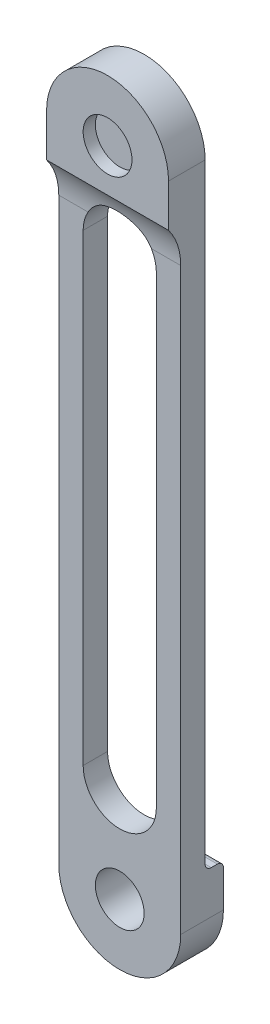
ISO-10303-21;
HEADER;
FILE_DESCRIPTION(('STEP AP214'),'2;1');
FILE_NAME('part.step','',(''),(''),'','','');
FILE_SCHEMA(('AUTOMOTIVE_DESIGN { 1 0 10303 214 1 1 1 1 }'));
ENDSEC;
DATA;
#1=APPLICATION_CONTEXT('core data for automotive mechanical design processes');
#2=APPLICATION_PROTOCOL_DEFINITION('international standard','automotive_design',2000,#1);
#3=PRODUCT_CONTEXT('',#1,'mechanical');
#4=PRODUCT('Part','Part','',(#3));
#5=PRODUCT_RELATED_PRODUCT_CATEGORY('part','',(#4));
#6=PRODUCT_DEFINITION_FORMATION('','',#4);
#7=PRODUCT_DEFINITION_CONTEXT('part definition',#1,'design');
#8=PRODUCT_DEFINITION('design','',#6,#7);
#9=PRODUCT_DEFINITION_SHAPE('','',#8);
#10=(LENGTH_UNIT() NAMED_UNIT(*) SI_UNIT(.MILLI.,.METRE.));
#11=(NAMED_UNIT(*) PLANE_ANGLE_UNIT() SI_UNIT($,.RADIAN.));
#12=(NAMED_UNIT(*) SI_UNIT($,.STERADIAN.) SOLID_ANGLE_UNIT());
#13=UNCERTAINTY_MEASURE_WITH_UNIT(LENGTH_MEASURE(1.E-05),#10,'distance_accuracy_value','');
#14=(GEOMETRIC_REPRESENTATION_CONTEXT(3) GLOBAL_UNCERTAINTY_ASSIGNED_CONTEXT((#13)) GLOBAL_UNIT_ASSIGNED_CONTEXT((#10,
#11,#12)) REPRESENTATION_CONTEXT('',''));
#15=CARTESIAN_POINT('',(0.,0.,0.));
#16=DIRECTION('',(0.,0.,1.));
#17=DIRECTION('',(1.,0.,0.));
#18=AXIS2_PLACEMENT_3D('',#15,#16,#17);
#19=CARTESIAN_POINT('',(0.,0.,4.));
#20=DIRECTION('',(0.,0.,1.));
#21=DIRECTION('',(1.,0.,0.));
#22=AXIS2_PLACEMENT_3D('',#19,#20,#21);
#23=PLANE('',#22);
#24=DIRECTION('',(0.,-1.,0.));
#25=VECTOR('',#24,1.);
#26=CARTESIAN_POINT('',(10.,0.,4.));
#27=LINE('',#26,#25);
#28=CARTESIAN_POINT('',(10.,41.,4.));
#29=VERTEX_POINT('',#28);
#30=CARTESIAN_POINT('',(9.99999999999999,-54.,4.));
#31=VERTEX_POINT('',#30);
#32=EDGE_CURVE('E305',#29,#31,#27,.T.);
#33=ORIENTED_EDGE('',*,*,#32,.F.);
#34=DIRECTION('',(-1.,0.,0.));
#35=VECTOR('',#34,1.);
#36=CARTESIAN_POINT('',(-9.99999999999999,41.,4.));
#37=LINE('',#36,#35);
#38=CARTESIAN_POINT('',(5.19615242270664,41.,4.));
#39=VERTEX_POINT('',#38);
#40=EDGE_CURVE('E408',#29,#39,#37,.T.);
#41=ORIENTED_EDGE('',*,*,#40,.T.);
#42=CARTESIAN_POINT('',(0.,38.,4.));
#43=DIRECTION('',(0.,0.,1.));
#44=DIRECTION('',(1.,0.,0.));
#45=AXIS2_PLACEMENT_3D('',#42,#43,#44);
#46=CIRCLE('',#45,6.00000000000001);
#47=CARTESIAN_POINT('',(5.99999999999999,38.,4.));
#48=VERTEX_POINT('',#47);
#49=EDGE_CURVE('E319',#48,#39,#46,.T.);
#50=ORIENTED_EDGE('',*,*,#49,.F.);
#51=DIRECTION('',(0.,-1.,0.));
#52=VECTOR('',#51,1.);
#53=CARTESIAN_POINT('',(5.99999999999999,0.,4.));
#54=LINE('',#53,#52);
#55=CARTESIAN_POINT('',(5.99999999999999,-38.,4.));
#56=VERTEX_POINT('',#55);
#57=EDGE_CURVE('E321',#48,#56,#54,.T.);
#58=ORIENTED_EDGE('',*,*,#57,.T.);
#59=CARTESIAN_POINT('',(0.,-38.,4.));
#60=DIRECTION('',(0.,0.,1.));
#61=DIRECTION('',(1.,0.,0.));
#62=AXIS2_PLACEMENT_3D('',#59,#60,#61);
#63=CIRCLE('',#62,6.00000000000001);
#64=CARTESIAN_POINT('',(-6.00000000000002,-38.,4.));
#65=VERTEX_POINT('',#64);
#66=EDGE_CURVE('E307',#65,#56,#63,.T.);
#67=ORIENTED_EDGE('',*,*,#66,.F.);
#68=DIRECTION('',(0.,-1.,0.));
#69=VECTOR('',#68,1.);
#70=CARTESIAN_POINT('',(-6.00000000000002,0.,4.));
#71=LINE('',#70,#69);
#72=CARTESIAN_POINT('',(-6.00000000000002,38.,4.));
#73=VERTEX_POINT('',#72);
#74=EDGE_CURVE('E312',#73,#65,#71,.T.);
#75=ORIENTED_EDGE('',*,*,#74,.F.);
#76=CARTESIAN_POINT('',(-5.19615242270664,41.,4.));
#77=VERTEX_POINT('',#76);
#78=EDGE_CURVE('E320',#77,#73,#46,.T.);
#79=ORIENTED_EDGE('',*,*,#78,.F.);
#80=DIRECTION('',(-1.,0.,0.));
#81=VECTOR('',#80,1.);
#82=CARTESIAN_POINT('',(-9.99999999999999,41.,4.));
#83=LINE('',#82,#81);
#84=CARTESIAN_POINT('',(-9.99999999999999,41.,4.));
#85=VERTEX_POINT('',#84);
#86=EDGE_CURVE('E152',#77,#85,#83,.T.);
#87=ORIENTED_EDGE('',*,*,#86,.T.);
#88=DIRECTION('',(0.,-1.,0.));
#89=VECTOR('',#88,1.);
#90=CARTESIAN_POINT('',(-9.99999999999999,0.,4.));
#91=LINE('',#90,#89);
#92=CARTESIAN_POINT('',(-9.99999999999999,-54.,4.));
#93=VERTEX_POINT('',#92);
#94=EDGE_CURVE('E304',#85,#93,#91,.T.);
#95=ORIENTED_EDGE('',*,*,#94,.T.);
#96=CARTESIAN_POINT('',(0.,-54.,4.));
#97=DIRECTION('',(0.,0.,1.));
#98=DIRECTION('',(1.,0.,0.));
#99=AXIS2_PLACEMENT_3D('',#96,#97,#98);
#100=CIRCLE('',#99,10.);
#101=EDGE_CURVE('E366',#93,#31,#100,.T.);
#102=ORIENTED_EDGE('',*,*,#101,.T.);
#103=EDGE_LOOP('',(#33,#41,#50,#58,#67,#75,#79,#87,#95,#102));
#104=FACE_BOUND('',#103,.T.);
#105=CARTESIAN_POINT('',(0.,-54.,4.));
#106=DIRECTION('',(0.,0.,1.));
#107=DIRECTION('',(1.,0.,0.));
#108=AXIS2_PLACEMENT_3D('',#105,#106,#107);
#109=CIRCLE('',#108,4.);
#110=CARTESIAN_POINT('',(3.99999999999999,-54.,4.));
#111=VERTEX_POINT('',#110);
#112=EDGE_CURVE('E296',#111,#111,#109,.T.);
#113=ORIENTED_EDGE('',*,*,#112,.F.);
#114=EDGE_LOOP('',(#113));
#115=FACE_BOUND('',#114,.T.);
#116=ADVANCED_FACE('F131',(#104,#115),#23,.T.);
#117=CARTESIAN_POINT('',(0.,0.,0.));
#118=DIRECTION('',(0.,0.,1.));
#119=DIRECTION('',(1.,0.,0.));
#120=AXIS2_PLACEMENT_3D('',#117,#118,#119);
#121=PLANE('',#120);
#122=DIRECTION('',(0.,-1.,0.));
#123=VECTOR('',#122,1.);
#124=CARTESIAN_POINT('',(10.,0.,0.));
#125=LINE('',#124,#123);
#126=CARTESIAN_POINT('',(10.,54.,0.));
#127=VERTEX_POINT('',#126);
#128=CARTESIAN_POINT('',(10.,-46.,0.));
#129=VERTEX_POINT('',#128);
#130=EDGE_CURVE('E250',#127,#129,#125,.T.);
#131=ORIENTED_EDGE('',*,*,#130,.T.);
#132=DIRECTION('',(1.,0.,0.));
#133=VECTOR('',#132,1.);
#134=CARTESIAN_POINT('',(-9.99999999999999,-46.,0.));
#135=LINE('',#134,#133);
#136=CARTESIAN_POINT('',(-9.99999999999999,-46.,0.));
#137=VERTEX_POINT('',#136);
#138=EDGE_CURVE('E394',#129,#137,#135,.F.);
#139=ORIENTED_EDGE('',*,*,#138,.T.);
#140=DIRECTION('',(0.,-1.,0.));
#141=VECTOR('',#140,1.);
#142=CARTESIAN_POINT('',(-9.99999999999999,0.,0.));
#143=LINE('',#142,#141);
#144=CARTESIAN_POINT('',(-9.99999999999999,54.,0.));
#145=VERTEX_POINT('',#144);
#146=EDGE_CURVE('E333',#145,#137,#143,.T.);
#147=ORIENTED_EDGE('',*,*,#146,.F.);
#148=CARTESIAN_POINT('',(0.,54.,0.));
#149=DIRECTION('',(0.,0.,1.));
#150=DIRECTION('',(1.,0.,0.));
#151=AXIS2_PLACEMENT_3D('',#148,#149,#150);
#152=CIRCLE('',#151,10.);
#153=EDGE_CURVE('E330',#127,#145,#152,.T.);
#154=ORIENTED_EDGE('',*,*,#153,.F.);
#155=EDGE_LOOP('',(#131,#139,#147,#154));
#156=FACE_BOUND('',#155,.T.);
#157=CARTESIAN_POINT('',(0.,-38.,0.));
#158=DIRECTION('',(0.,0.,1.));
#159=DIRECTION('',(1.,0.,0.));
#160=AXIS2_PLACEMENT_3D('',#157,#158,#159);
#161=CIRCLE('',#160,6.00000000000001);
#162=CARTESIAN_POINT('',(-6.00000000000002,-38.,0.));
#163=VERTEX_POINT('',#162);
#164=CARTESIAN_POINT('',(5.99999999999999,-38.,0.));
#165=VERTEX_POINT('',#164);
#166=EDGE_CURVE('E335',#163,#165,#161,.T.);
#167=ORIENTED_EDGE('',*,*,#166,.T.);
#168=DIRECTION('',(0.,-1.,0.));
#169=VECTOR('',#168,1.);
#170=CARTESIAN_POINT('',(5.99999999999999,0.,0.));
#171=LINE('',#170,#169);
#172=CARTESIAN_POINT('',(5.99999999999999,38.,0.));
#173=VERTEX_POINT('',#172);
#174=EDGE_CURVE('E306',#173,#165,#171,.T.);
#175=ORIENTED_EDGE('',*,*,#174,.F.);
#176=CARTESIAN_POINT('',(0.,38.,0.));
#177=DIRECTION('',(0.,0.,1.));
#178=DIRECTION('',(1.,0.,0.));
#179=AXIS2_PLACEMENT_3D('',#176,#177,#178);
#180=CIRCLE('',#179,6.00000000000001);
#181=CARTESIAN_POINT('',(-6.00000000000002,38.,0.));
#182=VERTEX_POINT('',#181);
#183=EDGE_CURVE('E341',#173,#182,#180,.T.);
#184=ORIENTED_EDGE('',*,*,#183,.T.);
#185=DIRECTION('',(0.,-1.,0.));
#186=VECTOR('',#185,1.);
#187=CARTESIAN_POINT('',(-6.00000000000002,0.,0.));
#188=LINE('',#187,#186);
#189=EDGE_CURVE('E336',#182,#163,#188,.T.);
#190=ORIENTED_EDGE('',*,*,#189,.T.);
#191=EDGE_LOOP('',(#167,#175,#184,#190));
#192=FACE_BOUND('',#191,.T.);
#193=ADVANCED_FACE('F469',(#156,#192),#121,.F.);
#194=CARTESIAN_POINT('',(5.99999999999999,0.,4.));
#195=DIRECTION('',(1.,0.,0.));
#196=DIRECTION('',(0.,0.,-1.));
#197=AXIS2_PLACEMENT_3D('',#194,#195,#196);
#198=PLANE('',#197);
#199=ORIENTED_EDGE('',*,*,#174,.T.);
#200=DIRECTION('',(0.,0.,-1.));
#201=VECTOR('',#200,1.);
#202=CARTESIAN_POINT('',(5.99999999999999,-38.,4.));
#203=LINE('',#202,#201);
#204=EDGE_CURVE('E255',#56,#165,#203,.T.);
#205=ORIENTED_EDGE('',*,*,#204,.F.);
#206=ORIENTED_EDGE('',*,*,#57,.F.);
#207=DIRECTION('',(0.,0.,-1.));
#208=VECTOR('',#207,1.);
#209=CARTESIAN_POINT('',(5.99999999999999,38.,4.));
#210=LINE('',#209,#208);
#211=EDGE_CURVE('E353',#48,#173,#210,.T.);
#212=ORIENTED_EDGE('',*,*,#211,.T.);
#213=EDGE_LOOP('',(#199,#205,#206,#212));
#214=FACE_BOUND('',#213,.T.);
#215=ADVANCED_FACE('F430',(#214),#198,.F.);
#216=CARTESIAN_POINT('',(0.,-38.,4.));
#217=DIRECTION('',(0.,0.,-1.));
#218=DIRECTION('',(-1.,0.,0.));
#219=AXIS2_PLACEMENT_3D('',#216,#217,#218);
#220=CYLINDRICAL_SURFACE('',#219,6.00000000000001);
#221=ORIENTED_EDGE('',*,*,#166,.F.);
#222=DIRECTION('',(0.,0.,-1.));
#223=VECTOR('',#222,1.);
#224=CARTESIAN_POINT('',(-6.00000000000002,-38.,4.));
#225=LINE('',#224,#223);
#226=EDGE_CURVE('E357',#65,#163,#225,.T.);
#227=ORIENTED_EDGE('',*,*,#226,.F.);
#228=ORIENTED_EDGE('',*,*,#66,.T.);
#229=ORIENTED_EDGE('',*,*,#204,.T.);
#230=EDGE_LOOP('',(#221,#227,#228,#229));
#231=FACE_BOUND('',#230,.T.);
#232=ADVANCED_FACE('F431',(#231),#220,.F.);
#233=CARTESIAN_POINT('',(-6.00000000000002,0.,4.));
#234=DIRECTION('',(1.,0.,0.));
#235=DIRECTION('',(0.,0.,-1.));
#236=AXIS2_PLACEMENT_3D('',#233,#234,#235);
#237=PLANE('',#236);
#238=ORIENTED_EDGE('',*,*,#189,.F.);
#239=DIRECTION('',(0.,0.,-1.));
#240=VECTOR('',#239,1.);
#241=CARTESIAN_POINT('',(-6.00000000000002,38.,4.));
#242=LINE('',#241,#240);
#243=EDGE_CURVE('E355',#73,#182,#242,.T.);
#244=ORIENTED_EDGE('',*,*,#243,.F.);
#245=ORIENTED_EDGE('',*,*,#74,.T.);
#246=ORIENTED_EDGE('',*,*,#226,.T.);
#247=EDGE_LOOP('',(#238,#244,#245,#246));
#248=FACE_BOUND('',#247,.T.);
#249=ADVANCED_FACE('F424',(#248),#237,.T.);
#250=CARTESIAN_POINT('',(0.,38.,4.));
#251=DIRECTION('',(0.,0.,-1.));
#252=DIRECTION('',(-1.,0.,0.));
#253=AXIS2_PLACEMENT_3D('',#250,#251,#252);
#254=CYLINDRICAL_SURFACE('',#253,6.00000000000001);
#255=ORIENTED_EDGE('',*,*,#183,.F.);
#256=ORIENTED_EDGE('',*,*,#211,.F.);
#257=ORIENTED_EDGE('',*,*,#49,.T.);
#258=CARTESIAN_POINT('',(5.19615242270664,41.,4.));
#259=CARTESIAN_POINT('',(5.11331579441467,41.143523832929,3.99998467639255));
#260=CARTESIAN_POINT('',(5.02451506891252,41.2835565824975,4.00308934931694));
#261=CARTESIAN_POINT('',(4.8358093789172,41.5555955489298,4.01452281001816));
#262=CARTESIAN_POINT('',(4.73591059449654,41.687606170266,4.02284870218329));
#263=CARTESIAN_POINT('',(4.52598489491243,41.9424195161534,4.04368656597809));
#264=CARTESIAN_POINT('',(4.41598220279933,42.0652430450646,4.05618870607559));
#265=CARTESIAN_POINT('',(4.18643763825092,42.301259980549,4.08431322792567));
#266=CARTESIAN_POINT('',(4.06689457084986,42.4144521770835,4.09993600091803));
#267=CARTESIAN_POINT('',(3.81930080089922,42.6303210444994,4.13318877692736));
#268=CARTESIAN_POINT('',(3.69126524923096,42.7330156534376,4.15081524337579));
#269=CARTESIAN_POINT('',(3.4272618060656,42.9275522680773,4.18703221688287));
#270=CARTESIAN_POINT('',(3.29129120765823,43.0193905376096,4.20562305267702));
#271=CARTESIAN_POINT('',(3.01222953226386,43.1916635844924,4.24272680765857));
#272=CARTESIAN_POINT('',(2.86913593115451,43.2720942800046,4.26123969666762));
#273=CARTESIAN_POINT('',(2.57673319135274,43.4210114194888,4.29718735006172));
#274=CARTESIAN_POINT('',(2.42742409839845,43.4894979513354,4.31462212237801));
#275=CARTESIAN_POINT('',(2.11833972090311,43.6161790716301,4.34805471128326));
#276=CARTESIAN_POINT('',(1.95838121195756,43.6739457052799,4.36398371703981));
#277=CARTESIAN_POINT('',(1.63394486596758,43.7757352227939,4.39281026661633));
#278=CARTESIAN_POINT('',(1.46946873605016,43.8197632225669,4.40570893841038));
#279=CARTESIAN_POINT('',(1.1371560804662,43.8937122252946,4.42775255549844));
#280=CARTESIAN_POINT('',(0.969320208420532,43.923635944889,4.43689822361831));
#281=CARTESIAN_POINT('',(0.631537118692514,43.9691036813901,4.45091666582647));
#282=CARTESIAN_POINT('',(0.46158999284537,43.9846483215532,4.4557896251134));
#283=CARTESIAN_POINT('',(0.126970828353843,44.000911020374,4.46089096756548));
#284=CARTESIAN_POINT('',(-0.0376743259214679,44.0021357801998,4.46127807564011));
#285=CARTESIAN_POINT('',(-0.366458634222943,43.9910571453904,4.45779850438539));
#286=CARTESIAN_POINT('',(-0.530597798538361,43.9787540276874,4.45393191213447));
#287=CARTESIAN_POINT('',(-0.857137805959305,43.9407337925752,4.44215058532851));
#288=CARTESIAN_POINT('',(-1.01953902072343,43.9150196040697,4.43423673467963));
#289=CARTESIAN_POINT('',(-1.34150245909796,43.8504163487046,4.41479075060965));
#290=CARTESIAN_POINT('',(-1.50106356203107,43.8115221973795,4.40325722094338));
#291=CARTESIAN_POINT('',(-1.96902643910323,43.6768881465112,4.36448778336134));
#292=CARTESIAN_POINT('',(-2.27191962553638,43.5625748252528,4.33286222255293));
#293=CARTESIAN_POINT('',(-2.85508114398768,43.2870271614493,4.26401018717736));
#294=CARTESIAN_POINT('',(-3.13533165440989,43.1257563104364,4.22677936555903));
#295=CARTESIAN_POINT('',(-3.53967150779992,42.8475986065355,4.17168106868603));
#296=CARTESIAN_POINT('',(-3.6745305732226,42.7461891132754,4.15304169057071));
#297=CARTESIAN_POINT('',(-3.93534856474189,42.532266551948,4.11749484848015));
#298=CARTESIAN_POINT('',(-4.06131094108763,42.4197578293265,4.10058671195068));
#299=CARTESIAN_POINT('',(-4.30327380122521,42.1845272734205,4.06969571204977));
#300=CARTESIAN_POINT('',(-4.41929056502149,42.0618228041912,4.05570801214856));
#301=CARTESIAN_POINT('',(-4.64069388084941,41.8068925844713,4.03178579659593));
#302=CARTESIAN_POINT('',(-4.74608669629944,41.6746725237101,4.02184888213265));
#303=CARTESIAN_POINT('',(-4.90890199425947,41.4516885565374,4.00983078470479));
#304=CARTESIAN_POINT('',(-4.96975066515538,41.3634879185804,4.00620525734659));
#305=CARTESIAN_POINT('',(-5.0866060698846,41.1840069623961,4.00128991267395));
#306=CARTESIAN_POINT('',(-5.14261786422777,41.092730005255,3.99999762534584));
#307=CARTESIAN_POINT('',(-5.19615242270664,41.,4.));
#308=B_SPLINE_CURVE_WITH_KNOTS('',3,(#258,#259,#260,#261,#262,#263,#264,#265,#266,#267,#268,
#269,#270,#271,#272,#273,#274,#275,#276,#277,#278,#279,#280,#281,#282,#283,#284,#285,#286,#287,
#288,#289,#290,#291,#292,#293,#294,#295,#296,#297,#298,#299,#300,#301,#302,#303,#304,#305,#306,
#307),.UNSPECIFIED.,.F.,.F.,(4,2,2,2,2,2,2,2,2,2,2,2,2,2,2,2,2,2,2,2,2,2,2,2,4),(0.,
0.496908421193224,0.993541507671036,1.48901358741519,1.98454782448408,2.47922062788449,
2.97406317852854,3.46908234856581,3.964097876534,4.4759061132024,4.98752353777605,
5.49904237889109,6.01053904735542,6.50387953505598,6.99720992366296,7.49043261673134,
7.98384579850863,8.95511024515655,9.92713185458714,10.4359013639234,10.9444724701085,
11.4521945322384,11.9596154909918,12.2810954648534,12.6022349137204),.UNSPECIFIED.);
#309=EDGE_CURVE('E414',#39,#77,#308,.T.);
#310=ORIENTED_EDGE('',*,*,#309,.T.);
#311=ORIENTED_EDGE('',*,*,#78,.T.);
#312=ORIENTED_EDGE('',*,*,#243,.T.);
#313=EDGE_LOOP('',(#255,#256,#257,#310,#311,#312));
#314=FACE_BOUND('',#313,.T.);
#315=ADVANCED_FACE('F416',(#314),#254,.F.);
#316=CARTESIAN_POINT('',(10.,0.,4.));
#317=DIRECTION('',(1.,0.,0.));
#318=DIRECTION('',(0.,0.,-1.));
#319=AXIS2_PLACEMENT_3D('',#316,#317,#318);
#320=PLANE('',#319);
#321=CARTESIAN_POINT('',(10.,-46.,-1.));
#322=DIRECTION('',(1.,0.,0.));
#323=DIRECTION('',(0.,0.,-1.));
#324=AXIS2_PLACEMENT_3D('',#321,#322,#323);
#325=CIRCLE('',#324,1.);
#326=CARTESIAN_POINT('',(10.,-47.,-1.));
#327=VERTEX_POINT('',#326);
#328=EDGE_CURVE('E399',#327,#129,#325,.F.);
#329=ORIENTED_EDGE('',*,*,#328,.T.);
#330=ORIENTED_EDGE('',*,*,#130,.F.);
#331=DIRECTION('',(0.,0.,-1.));
#332=VECTOR('',#331,1.);
#333=CARTESIAN_POINT('',(10.,54.,4.));
#334=LINE('',#333,#332);
#335=CARTESIAN_POINT('',(10.,54.,6.));
#336=VERTEX_POINT('',#335);
#337=EDGE_CURVE('E241',#336,#127,#334,.T.);
#338=ORIENTED_EDGE('',*,*,#337,.F.);
#339=DIRECTION('',(0.,-1.,0.));
#340=VECTOR('',#339,1.);
#341=CARTESIAN_POINT('',(10.,0.,6.));
#342=LINE('',#341,#340);
#343=CARTESIAN_POINT('',(10.,47.,6.));
#344=VERTEX_POINT('',#343);
#345=EDGE_CURVE('E246',#336,#344,#342,.T.);
#346=ORIENTED_EDGE('',*,*,#345,.T.);
#347=CARTESIAN_POINT('',(10.,41.,14.));
#348=DIRECTION('',(1.,0.,0.));
#349=DIRECTION('',(0.,0.,-1.));
#350=AXIS2_PLACEMENT_3D('',#347,#348,#349);
#351=CIRCLE('',#350,10.);
#352=EDGE_CURVE('E12',#344,#29,#351,.F.);
#353=ORIENTED_EDGE('',*,*,#352,.T.);
#354=ORIENTED_EDGE('',*,*,#32,.T.);
#355=DIRECTION('',(0.,0.,-1.));
#356=VECTOR('',#355,1.);
#357=CARTESIAN_POINT('',(9.99999999999999,-54.,4.));
#358=LINE('',#357,#356);
#359=CARTESIAN_POINT('',(10.,-54.,-3.));
#360=VERTEX_POINT('',#359);
#361=EDGE_CURVE('E369',#31,#360,#358,.T.);
#362=ORIENTED_EDGE('',*,*,#361,.T.);
#363=DIRECTION('',(0.,-1.,0.));
#364=VECTOR('',#363,1.);
#365=CARTESIAN_POINT('',(10.,0.,-3.));
#366=LINE('',#365,#364);
#367=CARTESIAN_POINT('',(10.,-48.,-3.));
#368=VERTEX_POINT('',#367);
#369=EDGE_CURVE('E286',#368,#360,#366,.T.);
#370=ORIENTED_EDGE('',*,*,#369,.F.);
#371=CARTESIAN_POINT('',(10.,-48.,-2.));
#372=DIRECTION('',(1.,0.,0.));
#373=DIRECTION('',(0.,0.,-1.));
#374=AXIS2_PLACEMENT_3D('',#371,#372,#373);
#375=CIRCLE('',#374,1.);
#376=CARTESIAN_POINT('',(10.,-47.,-2.));
#377=VERTEX_POINT('',#376);
#378=EDGE_CURVE('E379',#368,#377,#375,.T.);
#379=ORIENTED_EDGE('',*,*,#378,.T.);
#380=DIRECTION('',(0.,0.,1.));
#381=VECTOR('',#380,1.);
#382=CARTESIAN_POINT('',(10.,-47.,-3.));
#383=LINE('',#382,#381);
#384=EDGE_CURVE('E291',#377,#327,#383,.T.);
#385=ORIENTED_EDGE('',*,*,#384,.T.);
#386=EDGE_LOOP('',(#329,#330,#338,#346,#353,#354,#362,#370,#379,#385));
#387=FACE_BOUND('',#386,.T.);
#388=ADVANCED_FACE('F242',(#387),#320,.T.);
#389=CARTESIAN_POINT('',(-9.99999999999999,0.,4.));
#390=DIRECTION('',(1.,0.,0.));
#391=DIRECTION('',(0.,0.,-1.));
#392=AXIS2_PLACEMENT_3D('',#389,#390,#391);
#393=PLANE('',#392);
#394=ORIENTED_EDGE('',*,*,#94,.F.);
#395=CARTESIAN_POINT('',(-9.99999999999999,41.,14.));
#396=DIRECTION('',(1.,0.,0.));
#397=DIRECTION('',(0.,0.,-1.));
#398=AXIS2_PLACEMENT_3D('',#395,#396,#397);
#399=CIRCLE('',#398,10.);
#400=CARTESIAN_POINT('',(-9.99999999999999,47.,6.));
#401=VERTEX_POINT('',#400);
#402=EDGE_CURVE('E144',#85,#401,#399,.T.);
#403=ORIENTED_EDGE('',*,*,#402,.T.);
#404=DIRECTION('',(0.,-1.,0.));
#405=VECTOR('',#404,1.);
#406=CARTESIAN_POINT('',(-9.99999999999999,0.,6.));
#407=LINE('',#406,#405);
#408=CARTESIAN_POINT('',(-9.99999999999999,54.,6.));
#409=VERTEX_POINT('',#408);
#410=EDGE_CURVE('E264',#409,#401,#407,.T.);
#411=ORIENTED_EDGE('',*,*,#410,.F.);
#412=DIRECTION('',(0.,0.,-1.));
#413=VECTOR('',#412,1.);
#414=CARTESIAN_POINT('',(-9.99999999999999,54.,4.));
#415=LINE('',#414,#413);
#416=EDGE_CURVE('E254',#409,#145,#415,.T.);
#417=ORIENTED_EDGE('',*,*,#416,.T.);
#418=ORIENTED_EDGE('',*,*,#146,.T.);
#419=CARTESIAN_POINT('',(-9.99999999999999,-46.,-1.));
#420=DIRECTION('',(1.,0.,0.));
#421=DIRECTION('',(0.,0.,-1.));
#422=AXIS2_PLACEMENT_3D('',#419,#420,#421);
#423=CIRCLE('',#422,1.);
#424=CARTESIAN_POINT('',(-9.99999999999999,-47.,-1.));
#425=VERTEX_POINT('',#424);
#426=EDGE_CURVE('E396',#137,#425,#423,.T.);
#427=ORIENTED_EDGE('',*,*,#426,.T.);
#428=DIRECTION('',(0.,0.,1.));
#429=VECTOR('',#428,1.);
#430=CARTESIAN_POINT('',(-9.99999999999999,-47.,-3.));
#431=LINE('',#430,#429);
#432=CARTESIAN_POINT('',(-9.99999999999999,-47.,-2.));
#433=VERTEX_POINT('',#432);
#434=EDGE_CURVE('E295',#433,#425,#431,.T.);
#435=ORIENTED_EDGE('',*,*,#434,.F.);
#436=CARTESIAN_POINT('',(-9.99999999999999,-48.,-2.));
#437=DIRECTION('',(1.,0.,0.));
#438=DIRECTION('',(0.,0.,-1.));
#439=AXIS2_PLACEMENT_3D('',#436,#437,#438);
#440=CIRCLE('',#439,1.);
#441=CARTESIAN_POINT('',(-9.99999999999999,-48.,-3.));
#442=VERTEX_POINT('',#441);
#443=EDGE_CURVE('E387',#433,#442,#440,.F.);
#444=ORIENTED_EDGE('',*,*,#443,.T.);
#445=DIRECTION('',(0.,-1.,0.));
#446=VECTOR('',#445,1.);
#447=CARTESIAN_POINT('',(-9.99999999999999,0.,-3.));
#448=LINE('',#447,#446);
#449=CARTESIAN_POINT('',(-9.99999999999999,-54.,-3.));
#450=VERTEX_POINT('',#449);
#451=EDGE_CURVE('E284',#442,#450,#448,.T.);
#452=ORIENTED_EDGE('',*,*,#451,.T.);
#453=DIRECTION('',(0.,0.,-1.));
#454=VECTOR('',#453,1.);
#455=CARTESIAN_POINT('',(-9.99999999999999,-54.,4.));
#456=LINE('',#455,#454);
#457=EDGE_CURVE('E329',#93,#450,#456,.T.);
#458=ORIENTED_EDGE('',*,*,#457,.F.);
#459=EDGE_LOOP('',(#394,#403,#411,#417,#418,#427,#435,#444,#452,#458));
#460=FACE_BOUND('',#459,.T.);
#461=ADVANCED_FACE('F436',(#460),#393,.F.);
#462=CARTESIAN_POINT('',(0.,54.,4.));
#463=DIRECTION('',(0.,0.,-1.));
#464=DIRECTION('',(-1.,0.,0.));
#465=AXIS2_PLACEMENT_3D('',#462,#463,#464);
#466=CYLINDRICAL_SURFACE('',#465,10.);
#467=ORIENTED_EDGE('',*,*,#153,.T.);
#468=ORIENTED_EDGE('',*,*,#416,.F.);
#469=CARTESIAN_POINT('',(0.,54.,6.));
#470=DIRECTION('',(0.,0.,1.));
#471=DIRECTION('',(1.,0.,0.));
#472=AXIS2_PLACEMENT_3D('',#469,#470,#471);
#473=CIRCLE('',#472,10.);
#474=EDGE_CURVE('E259',#336,#409,#473,.T.);
#475=ORIENTED_EDGE('',*,*,#474,.F.);
#476=ORIENTED_EDGE('',*,*,#337,.T.);
#477=EDGE_LOOP('',(#467,#468,#475,#476));
#478=FACE_BOUND('',#477,.T.);
#479=ADVANCED_FACE('F256',(#478),#466,.T.);
#480=CARTESIAN_POINT('',(0.,-54.,4.));
#481=DIRECTION('',(0.,0.,-1.));
#482=DIRECTION('',(-1.,0.,0.));
#483=AXIS2_PLACEMENT_3D('',#480,#481,#482);
#484=CYLINDRICAL_SURFACE('',#483,4.);
#485=ORIENTED_EDGE('',*,*,#112,.T.);
#486=EDGE_LOOP('',(#485));
#487=FACE_BOUND('',#486,.T.);
#488=CARTESIAN_POINT('',(0.,-54.,-3.));
#489=DIRECTION('',(0.,0.,1.));
#490=DIRECTION('',(1.,0.,0.));
#491=AXIS2_PLACEMENT_3D('',#488,#489,#490);
#492=CIRCLE('',#491,4.);
#493=CARTESIAN_POINT('',(3.99999999999999,-54.,-3.));
#494=VERTEX_POINT('',#493);
#495=EDGE_CURVE('E278',#494,#494,#492,.T.);
#496=ORIENTED_EDGE('',*,*,#495,.F.);
#497=EDGE_LOOP('',(#496));
#498=FACE_BOUND('',#497,.T.);
#499=ADVANCED_FACE('F445',(#487,#498),#484,.F.);
#500=CARTESIAN_POINT('',(0.,-54.,4.));
#501=DIRECTION('',(0.,0.,-1.));
#502=DIRECTION('',(-1.,0.,0.));
#503=AXIS2_PLACEMENT_3D('',#500,#501,#502);
#504=CYLINDRICAL_SURFACE('',#503,10.);
#505=ORIENTED_EDGE('',*,*,#457,.T.);
#506=CARTESIAN_POINT('',(0.,-54.,-3.));
#507=DIRECTION('',(0.,0.,1.));
#508=DIRECTION('',(1.,0.,0.));
#509=AXIS2_PLACEMENT_3D('',#506,#507,#508);
#510=CIRCLE('',#509,10.);
#511=EDGE_CURVE('E288',#450,#360,#510,.T.);
#512=ORIENTED_EDGE('',*,*,#511,.T.);
#513=ORIENTED_EDGE('',*,*,#361,.F.);
#514=ORIENTED_EDGE('',*,*,#101,.F.);
#515=EDGE_LOOP('',(#505,#512,#513,#514));
#516=FACE_BOUND('',#515,.T.);
#517=ADVANCED_FACE('F450',(#516),#504,.T.);
#518=CARTESIAN_POINT('',(0.,-47.,-3.));
#519=DIRECTION('',(0.,-1.,0.));
#520=DIRECTION('',(0.,0.,-1.));
#521=AXIS2_PLACEMENT_3D('',#518,#519,#520);
#522=PLANE('',#521);
#523=ORIENTED_EDGE('',*,*,#384,.F.);
#524=DIRECTION('',(1.,0.,0.));
#525=VECTOR('',#524,1.);
#526=CARTESIAN_POINT('',(0.,-47.,-2.));
#527=LINE('',#526,#525);
#528=EDGE_CURVE('E386',#377,#433,#527,.F.);
#529=ORIENTED_EDGE('',*,*,#528,.T.);
#530=ORIENTED_EDGE('',*,*,#434,.T.);
#531=DIRECTION('',(1.,0.,0.));
#532=VECTOR('',#531,1.);
#533=CARTESIAN_POINT('',(10.,-47.,-1.));
#534=LINE('',#533,#532);
#535=EDGE_CURVE('E384',#425,#327,#534,.T.);
#536=ORIENTED_EDGE('',*,*,#535,.T.);
#537=EDGE_LOOP('',(#523,#529,#530,#536));
#538=FACE_BOUND('',#537,.T.);
#539=ADVANCED_FACE('F454',(#538),#522,.F.);
#540=CARTESIAN_POINT('',(0.,0.,-3.));
#541=DIRECTION('',(0.,0.,1.));
#542=DIRECTION('',(1.,0.,0.));
#543=AXIS2_PLACEMENT_3D('',#540,#541,#542);
#544=PLANE('',#543);
#545=ORIENTED_EDGE('',*,*,#495,.T.);
#546=EDGE_LOOP('',(#545));
#547=FACE_BOUND('',#546,.T.);
#548=ORIENTED_EDGE('',*,*,#451,.F.);
#549=DIRECTION('',(1.,0.,0.));
#550=VECTOR('',#549,1.);
#551=CARTESIAN_POINT('',(0.,-48.,-3.));
#552=LINE('',#551,#550);
#553=EDGE_CURVE('E359',#442,#368,#552,.T.);
#554=ORIENTED_EDGE('',*,*,#553,.T.);
#555=ORIENTED_EDGE('',*,*,#369,.T.);
#556=ORIENTED_EDGE('',*,*,#511,.F.);
#557=EDGE_LOOP('',(#548,#554,#555,#556));
#558=FACE_BOUND('',#557,.T.);
#559=ADVANCED_FACE('F457',(#547,#558),#544,.F.);
#560=CARTESIAN_POINT('',(0.,-48.,-2.));
#561=DIRECTION('',(1.,0.,0.));
#562=DIRECTION('',(0.,0.,-1.));
#563=AXIS2_PLACEMENT_3D('',#560,#561,#562);
#564=CYLINDRICAL_SURFACE('',#563,1.);
#565=ORIENTED_EDGE('',*,*,#443,.F.);
#566=ORIENTED_EDGE('',*,*,#528,.F.);
#567=ORIENTED_EDGE('',*,*,#378,.F.);
#568=ORIENTED_EDGE('',*,*,#553,.F.);
#569=EDGE_LOOP('',(#565,#566,#567,#568));
#570=FACE_BOUND('',#569,.T.);
#571=ADVANCED_FACE('F455',(#570),#564,.T.);
#572=CARTESIAN_POINT('',(0.,-46.,-1.));
#573=DIRECTION('',(-1.,0.,0.));
#574=DIRECTION('',(0.,0.,1.));
#575=AXIS2_PLACEMENT_3D('',#572,#573,#574);
#576=CYLINDRICAL_SURFACE('',#575,1.);
#577=ORIENTED_EDGE('',*,*,#426,.F.);
#578=ORIENTED_EDGE('',*,*,#138,.F.);
#579=ORIENTED_EDGE('',*,*,#328,.F.);
#580=ORIENTED_EDGE('',*,*,#535,.F.);
#581=EDGE_LOOP('',(#577,#578,#579,#580));
#582=FACE_BOUND('',#581,.T.);
#583=ADVANCED_FACE('F452',(#582),#576,.F.);
#584=CARTESIAN_POINT('',(0.,54.,6.));
#585=DIRECTION('',(0.,0.,-1.));
#586=DIRECTION('',(-1.,0.,0.));
#587=AXIS2_PLACEMENT_3D('',#584,#585,#586);
#588=CYLINDRICAL_SURFACE('',#587,4.);
#589=CARTESIAN_POINT('',(0.,54.,4.));
#590=DIRECTION('',(0.,0.,1.));
#591=DIRECTION('',(1.,0.,0.));
#592=AXIS2_PLACEMENT_3D('',#589,#590,#591);
#593=CIRCLE('',#592,4.);
#594=CARTESIAN_POINT('',(3.99999999999999,54.,4.));
#595=VERTEX_POINT('',#594);
#596=EDGE_CURVE('E401',#595,#595,#593,.F.);
#597=ORIENTED_EDGE('',*,*,#596,.T.);
#598=EDGE_LOOP('',(#597));
#599=FACE_BOUND('',#598,.T.);
#600=CARTESIAN_POINT('',(0.,54.,6.));
#601=DIRECTION('',(0.,0.,1.));
#602=DIRECTION('',(1.,0.,0.));
#603=AXIS2_PLACEMENT_3D('',#600,#601,#602);
#604=CIRCLE('',#603,4.);
#605=CARTESIAN_POINT('',(3.99999999999999,54.,6.));
#606=VERTEX_POINT('',#605);
#607=EDGE_CURVE('E270',#606,#606,#604,.T.);
#608=ORIENTED_EDGE('',*,*,#607,.T.);
#609=EDGE_LOOP('',(#608));
#610=FACE_BOUND('',#609,.T.);
#611=ADVANCED_FACE('F456',(#599,#610),#588,.F.);
#612=CARTESIAN_POINT('',(0.,0.,6.));
#613=DIRECTION('',(0.,0.,1.));
#614=DIRECTION('',(1.,0.,0.));
#615=AXIS2_PLACEMENT_3D('',#612,#613,#614);
#616=PLANE('',#615);
#617=ORIENTED_EDGE('',*,*,#607,.F.);
#618=EDGE_LOOP('',(#617));
#619=FACE_BOUND('',#618,.T.);
#620=ORIENTED_EDGE('',*,*,#345,.F.);
#621=ORIENTED_EDGE('',*,*,#474,.T.);
#622=ORIENTED_EDGE('',*,*,#410,.T.);
#623=DIRECTION('',(1.,0.,0.));
#624=VECTOR('',#623,1.);
#625=CARTESIAN_POINT('',(0.,47.,6.));
#626=LINE('',#625,#624);
#627=EDGE_CURVE('E269',#401,#344,#626,.T.);
#628=ORIENTED_EDGE('',*,*,#627,.T.);
#629=EDGE_LOOP('',(#620,#621,#622,#628));
#630=FACE_BOUND('',#629,.T.);
#631=ADVANCED_FACE('F263',(#619,#630),#616,.T.);
#632=ORIENTED_EDGE('',*,*,#596,.F.);
#633=EDGE_LOOP('',(#632));
#634=FACE_BOUND('',#633,.T.);
#635=ADVANCED_FACE('F474',(#634),#23,.T.);
#636=CARTESIAN_POINT('',(0.,41.,14.));
#637=DIRECTION('',(1.,0.,0.));
#638=DIRECTION('',(0.,0.,-1.));
#639=AXIS2_PLACEMENT_3D('',#636,#637,#638);
#640=CYLINDRICAL_SURFACE('',#639,10.);
#641=ORIENTED_EDGE('',*,*,#352,.F.);
#642=ORIENTED_EDGE('',*,*,#627,.F.);
#643=ORIENTED_EDGE('',*,*,#402,.F.);
#644=ORIENTED_EDGE('',*,*,#86,.F.);
#645=ORIENTED_EDGE('',*,*,#309,.F.);
#646=ORIENTED_EDGE('',*,*,#40,.F.);
#647=EDGE_LOOP('',(#641,#642,#643,#644,#645,#646));
#648=FACE_BOUND('',#647,.T.);
#649=ADVANCED_FACE('F138',(#648),#640,.F.);
#650=CLOSED_SHELL('',(#116,#193,#215,#232,#249,#315,#388,#461,#479,#499,#517,#539,#559,#571,
#583,#611,#631,#635,#649));
#651=MANIFOLD_SOLID_BREP('B2',#650);
#652=ADVANCED_BREP_SHAPE_REPRESENTATION('',(#18,#651),#14);
#653=SHAPE_DEFINITION_REPRESENTATION(#9,#652);
ENDSEC;
END-ISO-10303-21;
